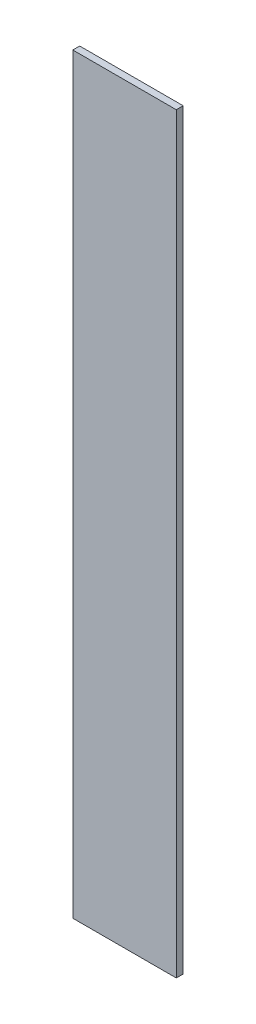
ISO-10303-21;
HEADER;
FILE_DESCRIPTION(('STEP AP214'),'2;1');
FILE_NAME('part.step','',(''),(''),'','','');
FILE_SCHEMA(('AUTOMOTIVE_DESIGN { 1 0 10303 214 1 1 1 1 }'));
ENDSEC;
DATA;
#1=APPLICATION_CONTEXT('core data for automotive mechanical design processes');
#2=APPLICATION_PROTOCOL_DEFINITION('international standard','automotive_design',2000,#1);
#3=PRODUCT_CONTEXT('',#1,'mechanical');
#4=PRODUCT('Part','Part','',(#3));
#5=PRODUCT_RELATED_PRODUCT_CATEGORY('part','',(#4));
#6=PRODUCT_DEFINITION_FORMATION('','',#4);
#7=PRODUCT_DEFINITION_CONTEXT('part definition',#1,'design');
#8=PRODUCT_DEFINITION('design','',#6,#7);
#9=PRODUCT_DEFINITION_SHAPE('','',#8);
#10=(LENGTH_UNIT() NAMED_UNIT(*) SI_UNIT(.MILLI.,.METRE.));
#11=(NAMED_UNIT(*) PLANE_ANGLE_UNIT() SI_UNIT($,.RADIAN.));
#12=(NAMED_UNIT(*) SI_UNIT($,.STERADIAN.) SOLID_ANGLE_UNIT());
#13=UNCERTAINTY_MEASURE_WITH_UNIT(LENGTH_MEASURE(1.E-05),#10,'distance_accuracy_value','');
#14=(GEOMETRIC_REPRESENTATION_CONTEXT(3) GLOBAL_UNCERTAINTY_ASSIGNED_CONTEXT((#13)) GLOBAL_UNIT_ASSIGNED_CONTEXT((#10,
#11,#12)) REPRESENTATION_CONTEXT('',''));
#15=CARTESIAN_POINT('',(0.,0.,0.));
#16=DIRECTION('',(0.,0.,1.));
#17=DIRECTION('',(1.,0.,0.));
#18=AXIS2_PLACEMENT_3D('',#15,#16,#17);
#19=CARTESIAN_POINT('',(15.,-109.,2.));
#20=DIRECTION('',(-1.,0.,0.));
#21=DIRECTION('',(0.,0.,1.));
#22=AXIS2_PLACEMENT_3D('',#19,#20,#21);
#23=PLANE('',#22);
#24=DIRECTION('',(0.,1.,0.));
#25=VECTOR('',#24,1.);
#26=CARTESIAN_POINT('',(15.,-109.,0.));
#27=LINE('',#26,#25);
#28=CARTESIAN_POINT('',(15.,-109.,0.));
#29=VERTEX_POINT('',#28);
#30=CARTESIAN_POINT('',(15.,109.,0.));
#31=VERTEX_POINT('',#30);
#32=EDGE_CURVE('E99',#29,#31,#27,.T.);
#33=ORIENTED_EDGE('',*,*,#32,.T.);
#34=DIRECTION('',(0.,0.,-1.));
#35=VECTOR('',#34,1.);
#36=CARTESIAN_POINT('',(15.,109.,2.));
#37=LINE('',#36,#35);
#38=CARTESIAN_POINT('',(15.,109.,2.));
#39=VERTEX_POINT('',#38);
#40=EDGE_CURVE('E11',#39,#31,#37,.T.);
#41=ORIENTED_EDGE('',*,*,#40,.F.);
#42=DIRECTION('',(0.,1.,0.));
#43=VECTOR('',#42,1.);
#44=CARTESIAN_POINT('',(15.,-109.,2.));
#45=LINE('',#44,#43);
#46=CARTESIAN_POINT('',(15.,-109.,2.));
#47=VERTEX_POINT('',#46);
#48=EDGE_CURVE('E87',#47,#39,#45,.T.);
#49=ORIENTED_EDGE('',*,*,#48,.F.);
#50=DIRECTION('',(0.,0.,-1.));
#51=VECTOR('',#50,1.);
#52=CARTESIAN_POINT('',(15.,-109.,2.));
#53=LINE('',#52,#51);
#54=EDGE_CURVE('E95',#47,#29,#53,.T.);
#55=ORIENTED_EDGE('',*,*,#54,.T.);
#56=EDGE_LOOP('',(#33,#41,#49,#55));
#57=FACE_BOUND('',#56,.T.);
#58=ADVANCED_FACE('F36',(#57),#23,.F.);
#59=CARTESIAN_POINT('',(-15.,109.,2.));
#60=DIRECTION('',(0.,-1.,0.));
#61=DIRECTION('',(0.,0.,-1.));
#62=AXIS2_PLACEMENT_3D('',#59,#60,#61);
#63=PLANE('',#62);
#64=DIRECTION('',(-1.,0.,0.));
#65=VECTOR('',#64,1.);
#66=CARTESIAN_POINT('',(-15.,109.,0.));
#67=LINE('',#66,#65);
#68=CARTESIAN_POINT('',(-15.,109.,0.));
#69=VERTEX_POINT('',#68);
#70=EDGE_CURVE('E91',#31,#69,#67,.T.);
#71=ORIENTED_EDGE('',*,*,#70,.T.);
#72=DIRECTION('',(0.,0.,-1.));
#73=VECTOR('',#72,1.);
#74=CARTESIAN_POINT('',(-15.,109.,2.));
#75=LINE('',#74,#73);
#76=CARTESIAN_POINT('',(-15.,109.,2.));
#77=VERTEX_POINT('',#76);
#78=EDGE_CURVE('E44',#77,#69,#75,.T.);
#79=ORIENTED_EDGE('',*,*,#78,.F.);
#80=DIRECTION('',(-1.,0.,0.));
#81=VECTOR('',#80,1.);
#82=CARTESIAN_POINT('',(-15.,109.,2.));
#83=LINE('',#82,#81);
#84=EDGE_CURVE('E82',#39,#77,#83,.T.);
#85=ORIENTED_EDGE('',*,*,#84,.F.);
#86=ORIENTED_EDGE('',*,*,#40,.T.);
#87=EDGE_LOOP('',(#71,#79,#85,#86));
#88=FACE_BOUND('',#87,.T.);
#89=ADVANCED_FACE('F90',(#88),#63,.F.);
#90=CARTESIAN_POINT('',(-15.,-109.,2.));
#91=DIRECTION('',(1.,0.,0.));
#92=DIRECTION('',(0.,0.,-1.));
#93=AXIS2_PLACEMENT_3D('',#90,#91,#92);
#94=PLANE('',#93);
#95=DIRECTION('',(0.,-1.,0.));
#96=VECTOR('',#95,1.);
#97=CARTESIAN_POINT('',(-15.,-109.,0.));
#98=LINE('',#97,#96);
#99=CARTESIAN_POINT('',(-15.,-109.,0.));
#100=VERTEX_POINT('',#99);
#101=EDGE_CURVE('E69',#69,#100,#98,.T.);
#102=ORIENTED_EDGE('',*,*,#101,.T.);
#103=DIRECTION('',(0.,0.,-1.));
#104=VECTOR('',#103,1.);
#105=CARTESIAN_POINT('',(-15.,-109.,2.));
#106=LINE('',#105,#104);
#107=CARTESIAN_POINT('',(-15.,-109.,2.));
#108=VERTEX_POINT('',#107);
#109=EDGE_CURVE('E92',#108,#100,#106,.T.);
#110=ORIENTED_EDGE('',*,*,#109,.F.);
#111=DIRECTION('',(0.,-1.,0.));
#112=VECTOR('',#111,1.);
#113=CARTESIAN_POINT('',(-15.,-109.,2.));
#114=LINE('',#113,#112);
#115=EDGE_CURVE('E85',#77,#108,#114,.T.);
#116=ORIENTED_EDGE('',*,*,#115,.F.);
#117=ORIENTED_EDGE('',*,*,#78,.T.);
#118=EDGE_LOOP('',(#102,#110,#116,#117));
#119=FACE_BOUND('',#118,.T.);
#120=ADVANCED_FACE('F93',(#119),#94,.F.);
#121=CARTESIAN_POINT('',(-15.,-109.,2.));
#122=DIRECTION('',(0.,1.,0.));
#123=DIRECTION('',(0.,0.,1.));
#124=AXIS2_PLACEMENT_3D('',#121,#122,#123);
#125=PLANE('',#124);
#126=DIRECTION('',(1.,0.,0.));
#127=VECTOR('',#126,1.);
#128=CARTESIAN_POINT('',(-15.,-109.,0.));
#129=LINE('',#128,#127);
#130=EDGE_CURVE('E75',#100,#29,#129,.T.);
#131=ORIENTED_EDGE('',*,*,#130,.T.);
#132=ORIENTED_EDGE('',*,*,#54,.F.);
#133=DIRECTION('',(1.,0.,0.));
#134=VECTOR('',#133,1.);
#135=CARTESIAN_POINT('',(-15.,-109.,2.));
#136=LINE('',#135,#134);
#137=EDGE_CURVE('E52',#108,#47,#136,.T.);
#138=ORIENTED_EDGE('',*,*,#137,.F.);
#139=ORIENTED_EDGE('',*,*,#109,.T.);
#140=EDGE_LOOP('',(#131,#132,#138,#139));
#141=FACE_BOUND('',#140,.T.);
#142=ADVANCED_FACE('F106',(#141),#125,.F.);
#143=CARTESIAN_POINT('',(0.,0.,2.));
#144=DIRECTION('',(0.,0.,-1.));
#145=DIRECTION('',(-1.,0.,0.));
#146=AXIS2_PLACEMENT_3D('',#143,#144,#145);
#147=PLANE('',#146);
#148=ORIENTED_EDGE('',*,*,#48,.T.);
#149=ORIENTED_EDGE('',*,*,#84,.T.);
#150=ORIENTED_EDGE('',*,*,#115,.T.);
#151=ORIENTED_EDGE('',*,*,#137,.T.);
#152=EDGE_LOOP('',(#148,#149,#150,#151));
#153=FACE_BOUND('',#152,.T.);
#154=ADVANCED_FACE('F83',(#153),#147,.F.);
#155=CARTESIAN_POINT('',(0.,0.,0.));
#156=DIRECTION('',(0.,0.,-1.));
#157=DIRECTION('',(-1.,0.,0.));
#158=AXIS2_PLACEMENT_3D('',#155,#156,#157);
#159=PLANE('',#158);
#160=ORIENTED_EDGE('',*,*,#32,.F.);
#161=ORIENTED_EDGE('',*,*,#130,.F.);
#162=ORIENTED_EDGE('',*,*,#101,.F.);
#163=ORIENTED_EDGE('',*,*,#70,.F.);
#164=EDGE_LOOP('',(#160,#161,#162,#163));
#165=FACE_BOUND('',#164,.T.);
#166=ADVANCED_FACE('F109',(#165),#159,.T.);
#167=CLOSED_SHELL('',(#58,#89,#120,#142,#154,#166));
#168=MANIFOLD_SOLID_BREP('B2',#167);
#169=ADVANCED_BREP_SHAPE_REPRESENTATION('',(#18,#168),#14);
#170=SHAPE_DEFINITION_REPRESENTATION(#9,#169);
ENDSEC;
END-ISO-10303-21;
